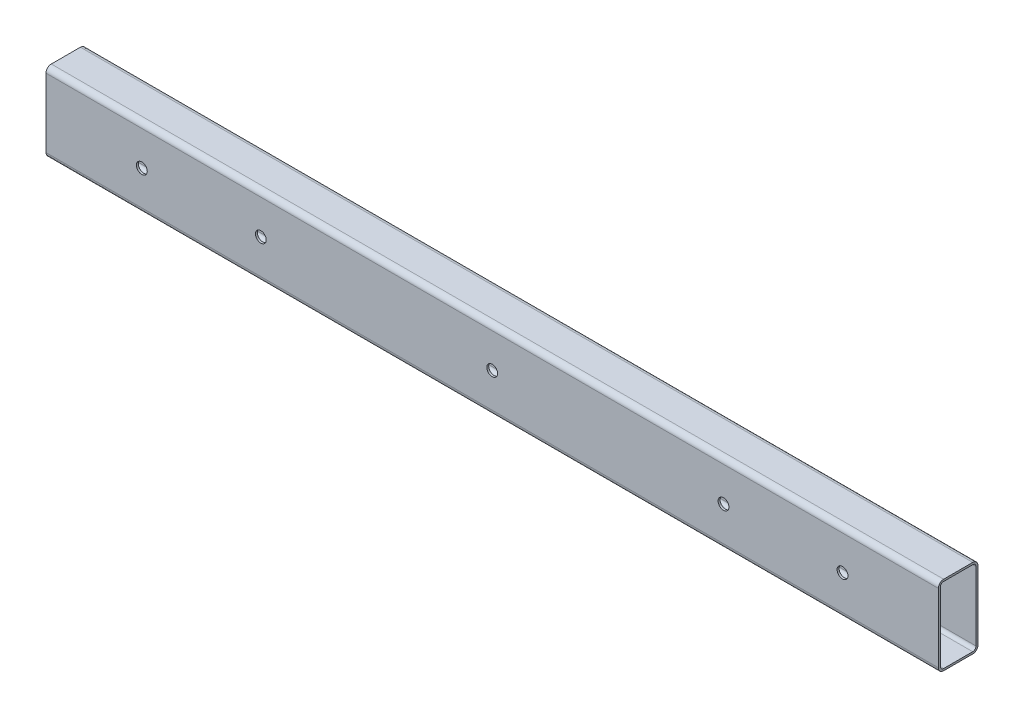
ISO-10303-21;
HEADER;
FILE_DESCRIPTION(('STEP AP214'),'2;1');
FILE_NAME('part.step','',(''),(''),'','','');
FILE_SCHEMA(('AUTOMOTIVE_DESIGN { 1 0 10303 214 1 1 1 1 }'));
ENDSEC;
DATA;
#1=APPLICATION_CONTEXT('core data for automotive mechanical design processes');
#2=APPLICATION_PROTOCOL_DEFINITION('international standard','automotive_design',2000,#1);
#3=PRODUCT_CONTEXT('',#1,'mechanical');
#4=PRODUCT('Part','Part','',(#3));
#5=PRODUCT_RELATED_PRODUCT_CATEGORY('part','',(#4));
#6=PRODUCT_DEFINITION_FORMATION('','',#4);
#7=PRODUCT_DEFINITION_CONTEXT('part definition',#1,'design');
#8=PRODUCT_DEFINITION('design','',#6,#7);
#9=PRODUCT_DEFINITION_SHAPE('','',#8);
#10=(LENGTH_UNIT() NAMED_UNIT(*) SI_UNIT(.MILLI.,.METRE.));
#11=(NAMED_UNIT(*) PLANE_ANGLE_UNIT() SI_UNIT($,.RADIAN.));
#12=(NAMED_UNIT(*) SI_UNIT($,.STERADIAN.) SOLID_ANGLE_UNIT());
#13=UNCERTAINTY_MEASURE_WITH_UNIT(LENGTH_MEASURE(1.E-05),#10,'distance_accuracy_value','');
#14=(GEOMETRIC_REPRESENTATION_CONTEXT(3) GLOBAL_UNCERTAINTY_ASSIGNED_CONTEXT((#13)) GLOBAL_UNIT_ASSIGNED_CONTEXT((#10,
#11,#12)) REPRESENTATION_CONTEXT('',''));
#15=CARTESIAN_POINT('',(0.,0.,0.));
#16=DIRECTION('',(0.,0.,1.));
#17=DIRECTION('',(1.,0.,0.));
#18=AXIS2_PLACEMENT_3D('',#15,#16,#17);
#19=CARTESIAN_POINT('',(-675.,-52.,22.));
#20=DIRECTION('',(1.,0.,0.));
#21=DIRECTION('',(0.,0.,-1.));
#22=AXIS2_PLACEMENT_3D('',#19,#20,#21);
#23=CYLINDRICAL_SURFACE('',#22,8.);
#24=DIRECTION('',(1.,0.,0.));
#25=VECTOR('',#24,1.);
#26=CARTESIAN_POINT('',(-675.,-60.,22.));
#27=LINE('',#26,#25);
#28=CARTESIAN_POINT('',(-675.,-60.,22.));
#29=VERTEX_POINT('',#28);
#30=CARTESIAN_POINT('',(675.,-60.,22.));
#31=VERTEX_POINT('',#30);
#32=EDGE_CURVE('E365',#29,#31,#27,.T.);
#33=ORIENTED_EDGE('',*,*,#32,.T.);
#34=CARTESIAN_POINT('',(675.,-52.,22.));
#35=DIRECTION('',(1.,0.,0.));
#36=DIRECTION('',(0.,0.,-1.));
#37=AXIS2_PLACEMENT_3D('',#34,#35,#36);
#38=CIRCLE('',#37,8.);
#39=CARTESIAN_POINT('',(675.,-52.,30.));
#40=VERTEX_POINT('',#39);
#41=EDGE_CURVE('E289',#40,#31,#38,.T.);
#42=ORIENTED_EDGE('',*,*,#41,.F.);
#43=DIRECTION('',(1.,0.,0.));
#44=VECTOR('',#43,1.);
#45=CARTESIAN_POINT('',(-675.,-52.,30.));
#46=LINE('',#45,#44);
#47=CARTESIAN_POINT('',(-675.,-52.,30.));
#48=VERTEX_POINT('',#47);
#49=EDGE_CURVE('E12',#48,#40,#46,.T.);
#50=ORIENTED_EDGE('',*,*,#49,.F.);
#51=CARTESIAN_POINT('',(-675.,-52.,22.));
#52=DIRECTION('',(1.,0.,0.));
#53=DIRECTION('',(0.,0.,-1.));
#54=AXIS2_PLACEMENT_3D('',#51,#52,#53);
#55=CIRCLE('',#54,8.);
#56=EDGE_CURVE('E332',#48,#29,#55,.T.);
#57=ORIENTED_EDGE('',*,*,#56,.T.);
#58=EDGE_LOOP('',(#33,#42,#50,#57));
#59=FACE_BOUND('',#58,.T.);
#60=ADVANCED_FACE('F131',(#59),#23,.T.);
#61=CARTESIAN_POINT('',(-675.,-52.,30.));
#62=DIRECTION('',(0.,0.,1.));
#63=DIRECTION('',(1.,0.,0.));
#64=AXIS2_PLACEMENT_3D('',#61,#62,#63);
#65=PLANE('',#64);
#66=CARTESIAN_POINT('',(-530.000000000008,7.7715611723761E-12,30.));
#67=DIRECTION('',(0.,0.,1.));
#68=DIRECTION('',(1.,0.,0.));
#69=AXIS2_PLACEMENT_3D('',#66,#67,#68);
#70=CIRCLE('',#69,8.19999999999973);
#71=CARTESIAN_POINT('',(-521.800000000008,7.7715611723761E-12,30.));
#72=VERTEX_POINT('',#71);
#73=EDGE_CURVE('E415',#72,#72,#70,.F.);
#74=ORIENTED_EDGE('',*,*,#73,.T.);
#75=EDGE_LOOP('',(#74));
#76=FACE_BOUND('',#75,.T.);
#77=CARTESIAN_POINT('',(-350.000000000007,4.66293670342566E-12,30.));
#78=DIRECTION('',(0.,0.,1.));
#79=DIRECTION('',(1.,0.,0.));
#80=AXIS2_PLACEMENT_3D('',#77,#78,#79);
#81=CIRCLE('',#80,8.2);
#82=CARTESIAN_POINT('',(-341.800000000007,4.66293670342566E-12,30.));
#83=VERTEX_POINT('',#82);
#84=EDGE_CURVE('E400',#83,#83,#81,.F.);
#85=ORIENTED_EDGE('',*,*,#84,.T.);
#86=EDGE_LOOP('',(#85));
#87=FACE_BOUND('',#86,.T.);
#88=CARTESIAN_POINT('',(529.999999999993,4.66293670342566E-12,30.));
#89=DIRECTION('',(0.,0.,1.));
#90=DIRECTION('',(1.,0.,0.));
#91=AXIS2_PLACEMENT_3D('',#88,#89,#90);
#92=CIRCLE('',#91,8.2);
#93=CARTESIAN_POINT('',(538.199999999993,4.66293670342566E-12,30.));
#94=VERTEX_POINT('',#93);
#95=EDGE_CURVE('E396',#94,#94,#92,.F.);
#96=ORIENTED_EDGE('',*,*,#95,.T.);
#97=EDGE_LOOP('',(#96));
#98=FACE_BOUND('',#97,.T.);
#99=CARTESIAN_POINT('',(349.999999999993,4.66293670342566E-12,30.));
#100=DIRECTION('',(0.,0.,1.));
#101=DIRECTION('',(1.,0.,0.));
#102=AXIS2_PLACEMENT_3D('',#99,#100,#101);
#103=CIRCLE('',#102,8.2);
#104=CARTESIAN_POINT('',(358.199999999993,4.66293670342566E-12,30.));
#105=VERTEX_POINT('',#104);
#106=EDGE_CURVE('E392',#105,#105,#103,.F.);
#107=ORIENTED_EDGE('',*,*,#106,.T.);
#108=EDGE_LOOP('',(#107));
#109=FACE_BOUND('',#108,.T.);
#110=CARTESIAN_POINT('',(0.,0.,30.));
#111=DIRECTION('',(0.,0.,1.));
#112=DIRECTION('',(1.,0.,0.));
#113=AXIS2_PLACEMENT_3D('',#110,#111,#112);
#114=CIRCLE('',#113,8.2);
#115=CARTESIAN_POINT('',(8.2,0.,30.));
#116=VERTEX_POINT('',#115);
#117=EDGE_CURVE('E383',#116,#116,#114,.T.);
#118=ORIENTED_EDGE('',*,*,#117,.F.);
#119=EDGE_LOOP('',(#118));
#120=FACE_BOUND('',#119,.T.);
#121=ORIENTED_EDGE('',*,*,#49,.T.);
#122=DIRECTION('',(0.,-1.,0.));
#123=VECTOR('',#122,1.);
#124=CARTESIAN_POINT('',(675.,-52.,30.));
#125=LINE('',#124,#123);
#126=CARTESIAN_POINT('',(675.,52.,30.));
#127=VERTEX_POINT('',#126);
#128=EDGE_CURVE('E310',#127,#40,#125,.T.);
#129=ORIENTED_EDGE('',*,*,#128,.F.);
#130=DIRECTION('',(1.,0.,0.));
#131=VECTOR('',#130,1.);
#132=CARTESIAN_POINT('',(-675.,52.,30.));
#133=LINE('',#132,#131);
#134=CARTESIAN_POINT('',(-675.,52.,30.));
#135=VERTEX_POINT('',#134);
#136=EDGE_CURVE('E139',#135,#127,#133,.T.);
#137=ORIENTED_EDGE('',*,*,#136,.F.);
#138=DIRECTION('',(0.,-1.,0.));
#139=VECTOR('',#138,1.);
#140=CARTESIAN_POINT('',(-675.,-52.,30.));
#141=LINE('',#140,#139);
#142=EDGE_CURVE('E363',#135,#48,#141,.T.);
#143=ORIENTED_EDGE('',*,*,#142,.T.);
#144=EDGE_LOOP('',(#121,#129,#137,#143));
#145=FACE_BOUND('',#144,.T.);
#146=ADVANCED_FACE('F454',(#76,#87,#98,#109,#120,#145),#65,.T.);
#147=CARTESIAN_POINT('',(-675.,52.,22.));
#148=DIRECTION('',(1.,0.,0.));
#149=DIRECTION('',(0.,0.,-1.));
#150=AXIS2_PLACEMENT_3D('',#147,#148,#149);
#151=CYLINDRICAL_SURFACE('',#150,8.);
#152=ORIENTED_EDGE('',*,*,#136,.T.);
#153=CARTESIAN_POINT('',(675.,52.,22.));
#154=DIRECTION('',(1.,0.,0.));
#155=DIRECTION('',(0.,0.,-1.));
#156=AXIS2_PLACEMENT_3D('',#153,#154,#155);
#157=CIRCLE('',#156,8.);
#158=CARTESIAN_POINT('',(675.,60.,22.));
#159=VERTEX_POINT('',#158);
#160=EDGE_CURVE('E307',#159,#127,#157,.T.);
#161=ORIENTED_EDGE('',*,*,#160,.F.);
#162=DIRECTION('',(1.,0.,0.));
#163=VECTOR('',#162,1.);
#164=CARTESIAN_POINT('',(-675.,60.,22.));
#165=LINE('',#164,#163);
#166=CARTESIAN_POINT('',(-675.,60.,22.));
#167=VERTEX_POINT('',#166);
#168=EDGE_CURVE('E368',#167,#159,#165,.T.);
#169=ORIENTED_EDGE('',*,*,#168,.F.);
#170=CARTESIAN_POINT('',(-675.,52.,22.));
#171=DIRECTION('',(1.,0.,0.));
#172=DIRECTION('',(0.,0.,-1.));
#173=AXIS2_PLACEMENT_3D('',#170,#171,#172);
#174=CIRCLE('',#173,8.);
#175=EDGE_CURVE('E360',#167,#135,#174,.T.);
#176=ORIENTED_EDGE('',*,*,#175,.T.);
#177=EDGE_LOOP('',(#152,#161,#169,#176));
#178=FACE_BOUND('',#177,.T.);
#179=ADVANCED_FACE('F450',(#178),#151,.T.);
#180=CARTESIAN_POINT('',(-675.,60.,22.));
#181=DIRECTION('',(0.,1.,0.));
#182=DIRECTION('',(0.,0.,1.));
#183=AXIS2_PLACEMENT_3D('',#180,#181,#182);
#184=PLANE('',#183);
#185=ORIENTED_EDGE('',*,*,#168,.T.);
#186=DIRECTION('',(0.,0.,1.));
#187=VECTOR('',#186,1.);
#188=CARTESIAN_POINT('',(675.,60.,22.));
#189=LINE('',#188,#187);
#190=CARTESIAN_POINT('',(675.,60.,-22.));
#191=VERTEX_POINT('',#190);
#192=EDGE_CURVE('E304',#191,#159,#189,.T.);
#193=ORIENTED_EDGE('',*,*,#192,.F.);
#194=DIRECTION('',(1.,0.,0.));
#195=VECTOR('',#194,1.);
#196=CARTESIAN_POINT('',(-675.,60.,-22.));
#197=LINE('',#196,#195);
#198=CARTESIAN_POINT('',(-675.,60.,-22.));
#199=VERTEX_POINT('',#198);
#200=EDGE_CURVE('E370',#199,#191,#197,.T.);
#201=ORIENTED_EDGE('',*,*,#200,.F.);
#202=DIRECTION('',(0.,0.,1.));
#203=VECTOR('',#202,1.);
#204=CARTESIAN_POINT('',(-675.,60.,22.));
#205=LINE('',#204,#203);
#206=EDGE_CURVE('E357',#199,#167,#205,.T.);
#207=ORIENTED_EDGE('',*,*,#206,.T.);
#208=EDGE_LOOP('',(#185,#193,#201,#207));
#209=FACE_BOUND('',#208,.T.);
#210=ADVANCED_FACE('F444',(#209),#184,.T.);
#211=CARTESIAN_POINT('',(-675.,52.,-22.));
#212=DIRECTION('',(1.,0.,0.));
#213=DIRECTION('',(0.,0.,-1.));
#214=AXIS2_PLACEMENT_3D('',#211,#212,#213);
#215=CYLINDRICAL_SURFACE('',#214,8.);
#216=ORIENTED_EDGE('',*,*,#200,.T.);
#217=CARTESIAN_POINT('',(675.,52.,-22.));
#218=DIRECTION('',(1.,0.,0.));
#219=DIRECTION('',(0.,0.,-1.));
#220=AXIS2_PLACEMENT_3D('',#217,#218,#219);
#221=CIRCLE('',#220,8.);
#222=CARTESIAN_POINT('',(675.,52.,-30.));
#223=VERTEX_POINT('',#222);
#224=EDGE_CURVE('E301',#223,#191,#221,.T.);
#225=ORIENTED_EDGE('',*,*,#224,.F.);
#226=DIRECTION('',(1.,0.,0.));
#227=VECTOR('',#226,1.);
#228=CARTESIAN_POINT('',(-675.,52.,-30.));
#229=LINE('',#228,#227);
#230=CARTESIAN_POINT('',(-675.,52.,-30.));
#231=VERTEX_POINT('',#230);
#232=EDGE_CURVE('E372',#231,#223,#229,.T.);
#233=ORIENTED_EDGE('',*,*,#232,.F.);
#234=CARTESIAN_POINT('',(-675.,52.,-22.));
#235=DIRECTION('',(1.,0.,0.));
#236=DIRECTION('',(0.,0.,-1.));
#237=AXIS2_PLACEMENT_3D('',#234,#235,#236);
#238=CIRCLE('',#237,8.);
#239=EDGE_CURVE('E354',#231,#199,#238,.T.);
#240=ORIENTED_EDGE('',*,*,#239,.T.);
#241=EDGE_LOOP('',(#216,#225,#233,#240));
#242=FACE_BOUND('',#241,.T.);
#243=ADVANCED_FACE('F431',(#242),#215,.T.);
#244=CARTESIAN_POINT('',(-675.,-52.,-30.));
#245=DIRECTION('',(0.,0.,-1.));
#246=DIRECTION('',(-1.,0.,0.));
#247=AXIS2_PLACEMENT_3D('',#244,#245,#246);
#248=PLANE('',#247);
#249=CARTESIAN_POINT('',(-530.000000000008,7.7715611723761E-12,-30.0000000000103));
#250=DIRECTION('',(0.,0.,1.));
#251=DIRECTION('',(1.,0.,0.));
#252=AXIS2_PLACEMENT_3D('',#249,#250,#251);
#253=CIRCLE('',#252,8.19999999999973);
#254=CARTESIAN_POINT('',(-521.800000000008,7.7715611723761E-12,-30.0000000000103));
#255=VERTEX_POINT('',#254);
#256=EDGE_CURVE('E632',#255,#255,#253,.T.);
#257=ORIENTED_EDGE('',*,*,#256,.T.);
#258=EDGE_LOOP('',(#257));
#259=FACE_BOUND('',#258,.T.);
#260=CARTESIAN_POINT('',(-350.000000000007,4.66293670342566E-12,-30.0000000000103));
#261=DIRECTION('',(0.,0.,1.));
#262=DIRECTION('',(1.,0.,0.));
#263=AXIS2_PLACEMENT_3D('',#260,#261,#262);
#264=CIRCLE('',#263,8.2);
#265=CARTESIAN_POINT('',(-341.800000000007,4.66293670342566E-12,-30.0000000000103));
#266=VERTEX_POINT('',#265);
#267=EDGE_CURVE('E636',#266,#266,#264,.T.);
#268=ORIENTED_EDGE('',*,*,#267,.T.);
#269=EDGE_LOOP('',(#268));
#270=FACE_BOUND('',#269,.T.);
#271=CARTESIAN_POINT('',(529.999999999993,4.66293670342566E-12,-30.0000000000103));
#272=DIRECTION('',(0.,0.,1.));
#273=DIRECTION('',(1.,0.,0.));
#274=AXIS2_PLACEMENT_3D('',#271,#272,#273);
#275=CIRCLE('',#274,8.2);
#276=CARTESIAN_POINT('',(538.199999999993,4.66293670342566E-12,-30.0000000000103));
#277=VERTEX_POINT('',#276);
#278=EDGE_CURVE('E565',#277,#277,#275,.T.);
#279=ORIENTED_EDGE('',*,*,#278,.T.);
#280=EDGE_LOOP('',(#279));
#281=FACE_BOUND('',#280,.T.);
#282=CARTESIAN_POINT('',(349.999999999993,4.66293670342566E-12,-30.0000000000103));
#283=DIRECTION('',(0.,0.,1.));
#284=DIRECTION('',(1.,0.,0.));
#285=AXIS2_PLACEMENT_3D('',#282,#283,#284);
#286=CIRCLE('',#285,8.2);
#287=CARTESIAN_POINT('',(358.199999999993,4.66293670342566E-12,-30.0000000000103));
#288=VERTEX_POINT('',#287);
#289=EDGE_CURVE('E388',#288,#288,#286,.T.);
#290=ORIENTED_EDGE('',*,*,#289,.T.);
#291=EDGE_LOOP('',(#290));
#292=FACE_BOUND('',#291,.T.);
#293=CARTESIAN_POINT('',(0.,0.,-30.));
#294=DIRECTION('',(0.,0.,-1.));
#295=DIRECTION('',(-1.,0.,0.));
#296=AXIS2_PLACEMENT_3D('',#293,#294,#295);
#297=CIRCLE('',#296,8.2);
#298=CARTESIAN_POINT('',(-8.2,0.,-30.));
#299=VERTEX_POINT('',#298);
#300=EDGE_CURVE('E265',#299,#299,#297,.T.);
#301=ORIENTED_EDGE('',*,*,#300,.F.);
#302=EDGE_LOOP('',(#301));
#303=FACE_BOUND('',#302,.T.);
#304=ORIENTED_EDGE('',*,*,#232,.T.);
#305=DIRECTION('',(0.,1.,0.));
#306=VECTOR('',#305,1.);
#307=CARTESIAN_POINT('',(675.,-52.,-30.));
#308=LINE('',#307,#306);
#309=CARTESIAN_POINT('',(675.,-52.,-30.));
#310=VERTEX_POINT('',#309);
#311=EDGE_CURVE('E298',#310,#223,#308,.T.);
#312=ORIENTED_EDGE('',*,*,#311,.F.);
#313=DIRECTION('',(1.,0.,0.));
#314=VECTOR('',#313,1.);
#315=CARTESIAN_POINT('',(-675.,-52.,-30.));
#316=LINE('',#315,#314);
#317=CARTESIAN_POINT('',(-675.,-52.,-30.));
#318=VERTEX_POINT('',#317);
#319=EDGE_CURVE('E374',#318,#310,#316,.T.);
#320=ORIENTED_EDGE('',*,*,#319,.F.);
#321=DIRECTION('',(0.,1.,0.));
#322=VECTOR('',#321,1.);
#323=CARTESIAN_POINT('',(-675.,-52.,-30.));
#324=LINE('',#323,#322);
#325=EDGE_CURVE('E351',#318,#231,#324,.T.);
#326=ORIENTED_EDGE('',*,*,#325,.T.);
#327=EDGE_LOOP('',(#304,#312,#320,#326));
#328=FACE_BOUND('',#327,.T.);
#329=ADVANCED_FACE('F427',(#259,#270,#281,#292,#303,#328),#248,.T.);
#330=CARTESIAN_POINT('',(-675.,-52.,-22.));
#331=DIRECTION('',(1.,0.,0.));
#332=DIRECTION('',(0.,0.,-1.));
#333=AXIS2_PLACEMENT_3D('',#330,#331,#332);
#334=CYLINDRICAL_SURFACE('',#333,8.);
#335=ORIENTED_EDGE('',*,*,#319,.T.);
#336=CARTESIAN_POINT('',(675.,-52.,-22.));
#337=DIRECTION('',(1.,0.,0.));
#338=DIRECTION('',(0.,0.,-1.));
#339=AXIS2_PLACEMENT_3D('',#336,#337,#338);
#340=CIRCLE('',#339,8.);
#341=CARTESIAN_POINT('',(675.,-60.,-22.));
#342=VERTEX_POINT('',#341);
#343=EDGE_CURVE('E295',#342,#310,#340,.T.);
#344=ORIENTED_EDGE('',*,*,#343,.F.);
#345=DIRECTION('',(1.,0.,0.));
#346=VECTOR('',#345,1.);
#347=CARTESIAN_POINT('',(-675.,-60.,-22.));
#348=LINE('',#347,#346);
#349=CARTESIAN_POINT('',(-675.,-60.,-22.));
#350=VERTEX_POINT('',#349);
#351=EDGE_CURVE('E376',#350,#342,#348,.T.);
#352=ORIENTED_EDGE('',*,*,#351,.F.);
#353=CARTESIAN_POINT('',(-675.,-52.,-22.));
#354=DIRECTION('',(1.,0.,0.));
#355=DIRECTION('',(0.,0.,-1.));
#356=AXIS2_PLACEMENT_3D('',#353,#354,#355);
#357=CIRCLE('',#356,8.);
#358=EDGE_CURVE('E348',#350,#318,#357,.T.);
#359=ORIENTED_EDGE('',*,*,#358,.T.);
#360=EDGE_LOOP('',(#335,#344,#352,#359));
#361=FACE_BOUND('',#360,.T.);
#362=ADVANCED_FACE('F430',(#361),#334,.T.);
#363=CARTESIAN_POINT('',(-675.,-60.,22.));
#364=DIRECTION('',(0.,-1.,0.));
#365=DIRECTION('',(0.,0.,-1.));
#366=AXIS2_PLACEMENT_3D('',#363,#364,#365);
#367=PLANE('',#366);
#368=ORIENTED_EDGE('',*,*,#351,.T.);
#369=DIRECTION('',(0.,0.,-1.));
#370=VECTOR('',#369,1.);
#371=CARTESIAN_POINT('',(675.,-60.,22.));
#372=LINE('',#371,#370);
#373=EDGE_CURVE('E292',#31,#342,#372,.T.);
#374=ORIENTED_EDGE('',*,*,#373,.F.);
#375=ORIENTED_EDGE('',*,*,#32,.F.);
#376=DIRECTION('',(0.,0.,-1.));
#377=VECTOR('',#376,1.);
#378=CARTESIAN_POINT('',(-675.,-60.,22.));
#379=LINE('',#378,#377);
#380=EDGE_CURVE('E345',#29,#350,#379,.T.);
#381=ORIENTED_EDGE('',*,*,#380,.T.);
#382=EDGE_LOOP('',(#368,#374,#375,#381));
#383=FACE_BOUND('',#382,.T.);
#384=ADVANCED_FACE('F473',(#383),#367,.T.);
#385=CARTESIAN_POINT('',(-675.,-52.,22.));
#386=DIRECTION('',(1.,0.,0.));
#387=DIRECTION('',(0.,0.,-1.));
#388=AXIS2_PLACEMENT_3D('',#385,#386,#387);
#389=PLANE('',#388);
#390=DIRECTION('',(0.,-1.,0.));
#391=VECTOR('',#390,1.);
#392=CARTESIAN_POINT('',(-675.,-52.,27.));
#393=LINE('',#392,#391);
#394=CARTESIAN_POINT('',(-675.,52.,27.));
#395=VERTEX_POINT('',#394);
#396=CARTESIAN_POINT('',(-675.,-52.,27.));
#397=VERTEX_POINT('',#396);
#398=EDGE_CURVE('E256',#395,#397,#393,.T.);
#399=ORIENTED_EDGE('',*,*,#398,.T.);
#400=CARTESIAN_POINT('',(-675.,-52.,22.));
#401=DIRECTION('',(1.,0.,0.));
#402=DIRECTION('',(0.,0.,-1.));
#403=AXIS2_PLACEMENT_3D('',#400,#401,#402);
#404=CIRCLE('',#403,5.);
#405=CARTESIAN_POINT('',(-675.,-57.,22.));
#406=VERTEX_POINT('',#405);
#407=EDGE_CURVE('E313',#397,#406,#404,.T.);
#408=ORIENTED_EDGE('',*,*,#407,.T.);
#409=DIRECTION('',(0.,0.,-1.));
#410=VECTOR('',#409,1.);
#411=CARTESIAN_POINT('',(-675.,-57.,22.));
#412=LINE('',#411,#410);
#413=CARTESIAN_POINT('',(-675.,-57.,-22.));
#414=VERTEX_POINT('',#413);
#415=EDGE_CURVE('E251',#406,#414,#412,.T.);
#416=ORIENTED_EDGE('',*,*,#415,.T.);
#417=CARTESIAN_POINT('',(-675.,-52.,-22.));
#418=DIRECTION('',(1.,0.,0.));
#419=DIRECTION('',(0.,0.,-1.));
#420=AXIS2_PLACEMENT_3D('',#417,#418,#419);
#421=CIRCLE('',#420,5.);
#422=CARTESIAN_POINT('',(-675.,-52.,-27.));
#423=VERTEX_POINT('',#422);
#424=EDGE_CURVE('E147',#414,#423,#421,.T.);
#425=ORIENTED_EDGE('',*,*,#424,.T.);
#426=DIRECTION('',(0.,1.,0.));
#427=VECTOR('',#426,1.);
#428=CARTESIAN_POINT('',(-675.,-52.,-27.));
#429=LINE('',#428,#427);
#430=CARTESIAN_POINT('',(-675.,52.,-27.));
#431=VERTEX_POINT('',#430);
#432=EDGE_CURVE('E317',#423,#431,#429,.T.);
#433=ORIENTED_EDGE('',*,*,#432,.T.);
#434=CARTESIAN_POINT('',(-675.,52.,-22.));
#435=DIRECTION('',(1.,0.,0.));
#436=DIRECTION('',(0.,0.,-1.));
#437=AXIS2_PLACEMENT_3D('',#434,#435,#436);
#438=CIRCLE('',#437,5.);
#439=CARTESIAN_POINT('',(-675.,57.,-22.));
#440=VERTEX_POINT('',#439);
#441=EDGE_CURVE('E320',#431,#440,#438,.T.);
#442=ORIENTED_EDGE('',*,*,#441,.T.);
#443=DIRECTION('',(0.,0.,1.));
#444=VECTOR('',#443,1.);
#445=CARTESIAN_POINT('',(-675.,57.,22.));
#446=LINE('',#445,#444);
#447=CARTESIAN_POINT('',(-675.,57.,22.));
#448=VERTEX_POINT('',#447);
#449=EDGE_CURVE('E323',#440,#448,#446,.T.);
#450=ORIENTED_EDGE('',*,*,#449,.T.);
#451=CARTESIAN_POINT('',(-675.,52.,22.));
#452=DIRECTION('',(1.,0.,0.));
#453=DIRECTION('',(0.,0.,-1.));
#454=AXIS2_PLACEMENT_3D('',#451,#452,#453);
#455=CIRCLE('',#454,5.);
#456=EDGE_CURVE('E326',#448,#395,#455,.T.);
#457=ORIENTED_EDGE('',*,*,#456,.T.);
#458=EDGE_LOOP('',(#399,#408,#416,#425,#433,#442,#450,#457));
#459=FACE_BOUND('',#458,.T.);
#460=ORIENTED_EDGE('',*,*,#56,.F.);
#461=ORIENTED_EDGE('',*,*,#142,.F.);
#462=ORIENTED_EDGE('',*,*,#175,.F.);
#463=ORIENTED_EDGE('',*,*,#206,.F.);
#464=ORIENTED_EDGE('',*,*,#239,.F.);
#465=ORIENTED_EDGE('',*,*,#325,.F.);
#466=ORIENTED_EDGE('',*,*,#358,.F.);
#467=ORIENTED_EDGE('',*,*,#380,.F.);
#468=EDGE_LOOP('',(#460,#461,#462,#463,#464,#465,#466,#467));
#469=FACE_BOUND('',#468,.T.);
#470=ADVANCED_FACE('F447',(#459,#469),#389,.F.);
#471=CARTESIAN_POINT('',(-675.,-52.,22.));
#472=DIRECTION('',(1.,0.,0.));
#473=DIRECTION('',(0.,0.,-1.));
#474=AXIS2_PLACEMENT_3D('',#471,#472,#473);
#475=CYLINDRICAL_SURFACE('',#474,5.);
#476=DIRECTION('',(1.,0.,0.));
#477=VECTOR('',#476,1.);
#478=CARTESIAN_POINT('',(-675.,-52.,27.));
#479=LINE('',#478,#477);
#480=CARTESIAN_POINT('',(675.,-52.,27.));
#481=VERTEX_POINT('',#480);
#482=EDGE_CURVE('E261',#397,#481,#479,.T.);
#483=ORIENTED_EDGE('',*,*,#482,.T.);
#484=CARTESIAN_POINT('',(675.,-52.,22.));
#485=DIRECTION('',(1.,0.,0.));
#486=DIRECTION('',(0.,0.,-1.));
#487=AXIS2_PLACEMENT_3D('',#484,#485,#486);
#488=CIRCLE('',#487,5.);
#489=CARTESIAN_POINT('',(675.,-57.,22.));
#490=VERTEX_POINT('',#489);
#491=EDGE_CURVE('E259',#481,#490,#488,.T.);
#492=ORIENTED_EDGE('',*,*,#491,.T.);
#493=DIRECTION('',(1.,0.,0.));
#494=VECTOR('',#493,1.);
#495=CARTESIAN_POINT('',(-675.,-57.,22.));
#496=LINE('',#495,#494);
#497=EDGE_CURVE('E244',#406,#490,#496,.T.);
#498=ORIENTED_EDGE('',*,*,#497,.F.);
#499=ORIENTED_EDGE('',*,*,#407,.F.);
#500=EDGE_LOOP('',(#483,#492,#498,#499));
#501=FACE_BOUND('',#500,.T.);
#502=ADVANCED_FACE('F260',(#501),#475,.F.);
#503=CARTESIAN_POINT('',(-675.,-52.,27.));
#504=DIRECTION('',(0.,0.,1.));
#505=DIRECTION('',(1.,0.,0.));
#506=AXIS2_PLACEMENT_3D('',#503,#504,#505);
#507=PLANE('',#506);
#508=CARTESIAN_POINT('',(-530.000000000008,7.7715611723761E-12,27.));
#509=DIRECTION('',(0.,0.,1.));
#510=DIRECTION('',(1.,0.,0.));
#511=AXIS2_PLACEMENT_3D('',#508,#509,#510);
#512=CIRCLE('',#511,8.19999999999973);
#513=CARTESIAN_POINT('',(-521.800000000008,7.7715611723761E-12,27.));
#514=VERTEX_POINT('',#513);
#515=EDGE_CURVE('E412',#514,#514,#512,.F.);
#516=ORIENTED_EDGE('',*,*,#515,.F.);
#517=EDGE_LOOP('',(#516));
#518=FACE_BOUND('',#517,.T.);
#519=CARTESIAN_POINT('',(-350.000000000007,4.66293670342566E-12,27.));
#520=DIRECTION('',(0.,0.,1.));
#521=DIRECTION('',(1.,0.,0.));
#522=AXIS2_PLACEMENT_3D('',#519,#520,#521);
#523=CIRCLE('',#522,8.2);
#524=CARTESIAN_POINT('',(-341.800000000007,4.66293670342566E-12,27.));
#525=VERTEX_POINT('',#524);
#526=EDGE_CURVE('E395',#525,#525,#523,.F.);
#527=ORIENTED_EDGE('',*,*,#526,.F.);
#528=EDGE_LOOP('',(#527));
#529=FACE_BOUND('',#528,.T.);
#530=CARTESIAN_POINT('',(529.999999999993,4.66293670342566E-12,27.));
#531=DIRECTION('',(0.,0.,1.));
#532=DIRECTION('',(1.,0.,0.));
#533=AXIS2_PLACEMENT_3D('',#530,#531,#532);
#534=CIRCLE('',#533,8.2);
#535=CARTESIAN_POINT('',(538.199999999993,4.66293670342566E-12,27.));
#536=VERTEX_POINT('',#535);
#537=EDGE_CURVE('E391',#536,#536,#534,.F.);
#538=ORIENTED_EDGE('',*,*,#537,.F.);
#539=EDGE_LOOP('',(#538));
#540=FACE_BOUND('',#539,.T.);
#541=CARTESIAN_POINT('',(349.999999999993,4.66293670342566E-12,27.));
#542=DIRECTION('',(0.,0.,1.));
#543=DIRECTION('',(1.,0.,0.));
#544=AXIS2_PLACEMENT_3D('',#541,#542,#543);
#545=CIRCLE('',#544,8.2);
#546=CARTESIAN_POINT('',(358.199999999993,4.66293670342566E-12,27.));
#547=VERTEX_POINT('',#546);
#548=EDGE_CURVE('E387',#547,#547,#545,.F.);
#549=ORIENTED_EDGE('',*,*,#548,.F.);
#550=EDGE_LOOP('',(#549));
#551=FACE_BOUND('',#550,.T.);
#552=CARTESIAN_POINT('',(0.,0.,27.));
#553=DIRECTION('',(0.,0.,1.));
#554=DIRECTION('',(1.,0.,0.));
#555=AXIS2_PLACEMENT_3D('',#552,#553,#554);
#556=CIRCLE('',#555,8.2);
#557=CARTESIAN_POINT('',(8.2,0.,27.));
#558=VERTEX_POINT('',#557);
#559=EDGE_CURVE('E382',#558,#558,#556,.T.);
#560=ORIENTED_EDGE('',*,*,#559,.T.);
#561=EDGE_LOOP('',(#560));
#562=FACE_BOUND('',#561,.T.);
#563=DIRECTION('',(1.,0.,0.));
#564=VECTOR('',#563,1.);
#565=CARTESIAN_POINT('',(-675.,52.,27.));
#566=LINE('',#565,#564);
#567=CARTESIAN_POINT('',(675.,52.,27.));
#568=VERTEX_POINT('',#567);
#569=EDGE_CURVE('E333',#395,#568,#566,.T.);
#570=ORIENTED_EDGE('',*,*,#569,.T.);
#571=DIRECTION('',(0.,-1.,0.));
#572=VECTOR('',#571,1.);
#573=CARTESIAN_POINT('',(675.,-52.,27.));
#574=LINE('',#573,#572);
#575=EDGE_CURVE('E287',#568,#481,#574,.T.);
#576=ORIENTED_EDGE('',*,*,#575,.T.);
#577=ORIENTED_EDGE('',*,*,#482,.F.);
#578=ORIENTED_EDGE('',*,*,#398,.F.);
#579=EDGE_LOOP('',(#570,#576,#577,#578));
#580=FACE_BOUND('',#579,.T.);
#581=ADVANCED_FACE('F487',(#518,#529,#540,#551,#562,#580),#507,.F.);
#582=CARTESIAN_POINT('',(-675.,52.,22.));
#583=DIRECTION('',(1.,0.,0.));
#584=DIRECTION('',(0.,0.,-1.));
#585=AXIS2_PLACEMENT_3D('',#582,#583,#584);
#586=CYLINDRICAL_SURFACE('',#585,5.);
#587=DIRECTION('',(1.,0.,0.));
#588=VECTOR('',#587,1.);
#589=CARTESIAN_POINT('',(-675.,57.,22.));
#590=LINE('',#589,#588);
#591=CARTESIAN_POINT('',(675.,57.,22.));
#592=VERTEX_POINT('',#591);
#593=EDGE_CURVE('E335',#448,#592,#590,.T.);
#594=ORIENTED_EDGE('',*,*,#593,.T.);
#595=CARTESIAN_POINT('',(675.,52.,22.));
#596=DIRECTION('',(1.,0.,0.));
#597=DIRECTION('',(0.,0.,-1.));
#598=AXIS2_PLACEMENT_3D('',#595,#596,#597);
#599=CIRCLE('',#598,5.);
#600=EDGE_CURVE('E284',#592,#568,#599,.T.);
#601=ORIENTED_EDGE('',*,*,#600,.T.);
#602=ORIENTED_EDGE('',*,*,#569,.F.);
#603=ORIENTED_EDGE('',*,*,#456,.F.);
#604=EDGE_LOOP('',(#594,#601,#602,#603));
#605=FACE_BOUND('',#604,.T.);
#606=ADVANCED_FACE('F495',(#605),#586,.F.);
#607=CARTESIAN_POINT('',(-675.,57.,22.));
#608=DIRECTION('',(0.,1.,0.));
#609=DIRECTION('',(0.,0.,1.));
#610=AXIS2_PLACEMENT_3D('',#607,#608,#609);
#611=PLANE('',#610);
#612=DIRECTION('',(1.,0.,0.));
#613=VECTOR('',#612,1.);
#614=CARTESIAN_POINT('',(-675.,57.,-22.));
#615=LINE('',#614,#613);
#616=CARTESIAN_POINT('',(675.,57.,-22.));
#617=VERTEX_POINT('',#616);
#618=EDGE_CURVE('E337',#440,#617,#615,.T.);
#619=ORIENTED_EDGE('',*,*,#618,.T.);
#620=DIRECTION('',(0.,0.,1.));
#621=VECTOR('',#620,1.);
#622=CARTESIAN_POINT('',(675.,57.,22.));
#623=LINE('',#622,#621);
#624=EDGE_CURVE('E281',#617,#592,#623,.T.);
#625=ORIENTED_EDGE('',*,*,#624,.T.);
#626=ORIENTED_EDGE('',*,*,#593,.F.);
#627=ORIENTED_EDGE('',*,*,#449,.F.);
#628=EDGE_LOOP('',(#619,#625,#626,#627));
#629=FACE_BOUND('',#628,.T.);
#630=ADVANCED_FACE('F498',(#629),#611,.F.);
#631=CARTESIAN_POINT('',(-675.,52.,-22.));
#632=DIRECTION('',(1.,0.,0.));
#633=DIRECTION('',(0.,0.,-1.));
#634=AXIS2_PLACEMENT_3D('',#631,#632,#633);
#635=CYLINDRICAL_SURFACE('',#634,5.);
#636=DIRECTION('',(1.,0.,0.));
#637=VECTOR('',#636,1.);
#638=CARTESIAN_POINT('',(-675.,52.,-27.));
#639=LINE('',#638,#637);
#640=CARTESIAN_POINT('',(675.,52.,-27.));
#641=VERTEX_POINT('',#640);
#642=EDGE_CURVE('E339',#431,#641,#639,.T.);
#643=ORIENTED_EDGE('',*,*,#642,.T.);
#644=CARTESIAN_POINT('',(675.,52.,-22.));
#645=DIRECTION('',(1.,0.,0.));
#646=DIRECTION('',(0.,0.,-1.));
#647=AXIS2_PLACEMENT_3D('',#644,#645,#646);
#648=CIRCLE('',#647,5.);
#649=EDGE_CURVE('E278',#641,#617,#648,.T.);
#650=ORIENTED_EDGE('',*,*,#649,.T.);
#651=ORIENTED_EDGE('',*,*,#618,.F.);
#652=ORIENTED_EDGE('',*,*,#441,.F.);
#653=EDGE_LOOP('',(#643,#650,#651,#652));
#654=FACE_BOUND('',#653,.T.);
#655=ADVANCED_FACE('F501',(#654),#635,.F.);
#656=CARTESIAN_POINT('',(-675.,-52.,-27.));
#657=DIRECTION('',(0.,0.,-1.));
#658=DIRECTION('',(-1.,0.,0.));
#659=AXIS2_PLACEMENT_3D('',#656,#657,#658);
#660=PLANE('',#659);
#661=CARTESIAN_POINT('',(-530.000000000008,7.7715611723761E-12,-27.));
#662=DIRECTION('',(0.,0.,-1.));
#663=DIRECTION('',(-1.,0.,0.));
#664=AXIS2_PLACEMENT_3D('',#661,#662,#663);
#665=CIRCLE('',#664,8.19999999999973);
#666=CARTESIAN_POINT('',(-538.200000000007,7.7715611723761E-12,-27.));
#667=VERTEX_POINT('',#666);
#668=EDGE_CURVE('E134',#667,#667,#665,.F.);
#669=ORIENTED_EDGE('',*,*,#668,.F.);
#670=EDGE_LOOP('',(#669));
#671=FACE_BOUND('',#670,.T.);
#672=CARTESIAN_POINT('',(-350.000000000007,4.66293670342566E-12,-27.));
#673=DIRECTION('',(0.,0.,-1.));
#674=DIRECTION('',(-1.,0.,0.));
#675=AXIS2_PLACEMENT_3D('',#672,#673,#674);
#676=CIRCLE('',#675,8.2);
#677=CARTESIAN_POINT('',(-358.200000000007,4.66293670342566E-12,-27.));
#678=VERTEX_POINT('',#677);
#679=EDGE_CURVE('E393',#678,#678,#676,.F.);
#680=ORIENTED_EDGE('',*,*,#679,.F.);
#681=EDGE_LOOP('',(#680));
#682=FACE_BOUND('',#681,.T.);
#683=CARTESIAN_POINT('',(529.999999999993,4.66293670342566E-12,-27.));
#684=DIRECTION('',(0.,0.,-1.));
#685=DIRECTION('',(-1.,0.,0.));
#686=AXIS2_PLACEMENT_3D('',#683,#684,#685);
#687=CIRCLE('',#686,8.2);
#688=CARTESIAN_POINT('',(521.799999999993,4.66293670342566E-12,-27.));
#689=VERTEX_POINT('',#688);
#690=EDGE_CURVE('E389',#689,#689,#687,.F.);
#691=ORIENTED_EDGE('',*,*,#690,.F.);
#692=EDGE_LOOP('',(#691));
#693=FACE_BOUND('',#692,.T.);
#694=CARTESIAN_POINT('',(349.999999999993,4.66293670342566E-12,-27.));
#695=DIRECTION('',(0.,0.,-1.));
#696=DIRECTION('',(-1.,0.,0.));
#697=AXIS2_PLACEMENT_3D('',#694,#695,#696);
#698=CIRCLE('',#697,8.2);
#699=CARTESIAN_POINT('',(341.799999999993,4.66293670342566E-12,-27.));
#700=VERTEX_POINT('',#699);
#701=EDGE_CURVE('E384',#700,#700,#698,.F.);
#702=ORIENTED_EDGE('',*,*,#701,.F.);
#703=EDGE_LOOP('',(#702));
#704=FACE_BOUND('',#703,.T.);
#705=CARTESIAN_POINT('',(0.,0.,-27.));
#706=DIRECTION('',(0.,0.,-1.));
#707=DIRECTION('',(-1.,0.,0.));
#708=AXIS2_PLACEMENT_3D('',#705,#706,#707);
#709=CIRCLE('',#708,8.2);
#710=CARTESIAN_POINT('',(-8.2,0.,-27.));
#711=VERTEX_POINT('',#710);
#712=EDGE_CURVE('E379',#711,#711,#709,.T.);
#713=ORIENTED_EDGE('',*,*,#712,.T.);
#714=EDGE_LOOP('',(#713));
#715=FACE_BOUND('',#714,.T.);
#716=DIRECTION('',(1.,0.,0.));
#717=VECTOR('',#716,1.);
#718=CARTESIAN_POINT('',(-675.,-52.,-27.));
#719=LINE('',#718,#717);
#720=CARTESIAN_POINT('',(675.,-52.,-27.));
#721=VERTEX_POINT('',#720);
#722=EDGE_CURVE('E341',#423,#721,#719,.T.);
#723=ORIENTED_EDGE('',*,*,#722,.T.);
#724=DIRECTION('',(0.,1.,0.));
#725=VECTOR('',#724,1.);
#726=CARTESIAN_POINT('',(675.,-52.,-27.));
#727=LINE('',#726,#725);
#728=EDGE_CURVE('E272',#721,#641,#727,.T.);
#729=ORIENTED_EDGE('',*,*,#728,.T.);
#730=ORIENTED_EDGE('',*,*,#642,.F.);
#731=ORIENTED_EDGE('',*,*,#432,.F.);
#732=EDGE_LOOP('',(#723,#729,#730,#731));
#733=FACE_BOUND('',#732,.T.);
#734=ADVANCED_FACE('F503',(#671,#682,#693,#704,#715,#733),#660,.F.);
#735=CARTESIAN_POINT('',(-675.,-52.,-22.));
#736=DIRECTION('',(1.,0.,0.));
#737=DIRECTION('',(0.,0.,-1.));
#738=AXIS2_PLACEMENT_3D('',#735,#736,#737);
#739=CYLINDRICAL_SURFACE('',#738,5.);
#740=DIRECTION('',(1.,0.,0.));
#741=VECTOR('',#740,1.);
#742=CARTESIAN_POINT('',(-675.,-57.,-22.));
#743=LINE('',#742,#741);
#744=CARTESIAN_POINT('',(675.,-57.,-22.));
#745=VERTEX_POINT('',#744);
#746=EDGE_CURVE('E255',#414,#745,#743,.T.);
#747=ORIENTED_EDGE('',*,*,#746,.T.);
#748=CARTESIAN_POINT('',(675.,-52.,-22.));
#749=DIRECTION('',(1.,0.,0.));
#750=DIRECTION('',(0.,0.,-1.));
#751=AXIS2_PLACEMENT_3D('',#748,#749,#750);
#752=CIRCLE('',#751,5.);
#753=EDGE_CURVE('E270',#745,#721,#752,.T.);
#754=ORIENTED_EDGE('',*,*,#753,.T.);
#755=ORIENTED_EDGE('',*,*,#722,.F.);
#756=ORIENTED_EDGE('',*,*,#424,.F.);
#757=EDGE_LOOP('',(#747,#754,#755,#756));
#758=FACE_BOUND('',#757,.T.);
#759=ADVANCED_FACE('F505',(#758),#739,.F.);
#760=CARTESIAN_POINT('',(-675.,-57.,22.));
#761=DIRECTION('',(0.,-1.,0.));
#762=DIRECTION('',(0.,0.,-1.));
#763=AXIS2_PLACEMENT_3D('',#760,#761,#762);
#764=PLANE('',#763);
#765=ORIENTED_EDGE('',*,*,#497,.T.);
#766=DIRECTION('',(0.,0.,-1.));
#767=VECTOR('',#766,1.);
#768=CARTESIAN_POINT('',(675.,-57.,22.));
#769=LINE('',#768,#767);
#770=EDGE_CURVE('E248',#490,#745,#769,.T.);
#771=ORIENTED_EDGE('',*,*,#770,.T.);
#772=ORIENTED_EDGE('',*,*,#746,.F.);
#773=ORIENTED_EDGE('',*,*,#415,.F.);
#774=EDGE_LOOP('',(#765,#771,#772,#773));
#775=FACE_BOUND('',#774,.T.);
#776=ADVANCED_FACE('F246',(#775),#764,.F.);
#777=CARTESIAN_POINT('',(675.,-52.,22.));
#778=DIRECTION('',(1.,0.,0.));
#779=DIRECTION('',(0.,0.,-1.));
#780=AXIS2_PLACEMENT_3D('',#777,#778,#779);
#781=PLANE('',#780);
#782=ORIENTED_EDGE('',*,*,#41,.T.);
#783=ORIENTED_EDGE('',*,*,#373,.T.);
#784=ORIENTED_EDGE('',*,*,#343,.T.);
#785=ORIENTED_EDGE('',*,*,#311,.T.);
#786=ORIENTED_EDGE('',*,*,#224,.T.);
#787=ORIENTED_EDGE('',*,*,#192,.T.);
#788=ORIENTED_EDGE('',*,*,#160,.T.);
#789=ORIENTED_EDGE('',*,*,#128,.T.);
#790=EDGE_LOOP('',(#782,#783,#784,#785,#786,#787,#788,#789));
#791=FACE_BOUND('',#790,.T.);
#792=ORIENTED_EDGE('',*,*,#770,.F.);
#793=ORIENTED_EDGE('',*,*,#491,.F.);
#794=ORIENTED_EDGE('',*,*,#575,.F.);
#795=ORIENTED_EDGE('',*,*,#600,.F.);
#796=ORIENTED_EDGE('',*,*,#624,.F.);
#797=ORIENTED_EDGE('',*,*,#649,.F.);
#798=ORIENTED_EDGE('',*,*,#728,.F.);
#799=ORIENTED_EDGE('',*,*,#753,.F.);
#800=EDGE_LOOP('',(#792,#793,#794,#795,#796,#797,#798,#799));
#801=FACE_BOUND('',#800,.T.);
#802=ADVANCED_FACE('F267',(#791,#801),#781,.T.);
#803=CARTESIAN_POINT('',(0.,0.,-80.));
#804=DIRECTION('',(0.,0.,1.));
#805=DIRECTION('',(1.,0.,0.));
#806=AXIS2_PLACEMENT_3D('',#803,#804,#805);
#807=CYLINDRICAL_SURFACE('',#806,8.2);
#808=ORIENTED_EDGE('',*,*,#300,.T.);
#809=EDGE_LOOP('',(#808));
#810=FACE_BOUND('',#809,.T.);
#811=ORIENTED_EDGE('',*,*,#712,.F.);
#812=EDGE_LOOP('',(#811));
#813=FACE_BOUND('',#812,.T.);
#814=ADVANCED_FACE('F424',(#810,#813),#807,.F.);
#815=ORIENTED_EDGE('',*,*,#117,.T.);
#816=EDGE_LOOP('',(#815));
#817=FACE_BOUND('',#816,.T.);
#818=ORIENTED_EDGE('',*,*,#559,.F.);
#819=EDGE_LOOP('',(#818));
#820=FACE_BOUND('',#819,.T.);
#821=ADVANCED_FACE('F528',(#817,#820),#807,.F.);
#822=CARTESIAN_POINT('',(349.999999999993,4.66293670342566E-12,79.9999999999897));
#823=DIRECTION('',(0.,0.,-1.));
#824=DIRECTION('',(-1.,0.,0.));
#825=AXIS2_PLACEMENT_3D('',#822,#823,#824);
#826=CYLINDRICAL_SURFACE('',#825,8.2);
#827=ORIENTED_EDGE('',*,*,#289,.F.);
#828=EDGE_LOOP('',(#827));
#829=FACE_BOUND('',#828,.T.);
#830=ORIENTED_EDGE('',*,*,#701,.T.);
#831=EDGE_LOOP('',(#830));
#832=FACE_BOUND('',#831,.T.);
#833=ADVANCED_FACE('F531',(#829,#832),#826,.F.);
#834=CARTESIAN_POINT('',(529.999999999993,4.66293670342566E-12,79.9999999999897));
#835=DIRECTION('',(0.,0.,-1.));
#836=DIRECTION('',(-1.,0.,0.));
#837=AXIS2_PLACEMENT_3D('',#834,#835,#836);
#838=CYLINDRICAL_SURFACE('',#837,8.2);
#839=ORIENTED_EDGE('',*,*,#278,.F.);
#840=EDGE_LOOP('',(#839));
#841=FACE_BOUND('',#840,.T.);
#842=ORIENTED_EDGE('',*,*,#690,.T.);
#843=EDGE_LOOP('',(#842));
#844=FACE_BOUND('',#843,.T.);
#845=ADVANCED_FACE('F550',(#841,#844),#838,.F.);
#846=CARTESIAN_POINT('',(-350.000000000007,4.66293670342566E-12,79.9999999999897));
#847=DIRECTION('',(0.,0.,-1.));
#848=DIRECTION('',(-1.,0.,0.));
#849=AXIS2_PLACEMENT_3D('',#846,#847,#848);
#850=CYLINDRICAL_SURFACE('',#849,8.2);
#851=ORIENTED_EDGE('',*,*,#267,.F.);
#852=EDGE_LOOP('',(#851));
#853=FACE_BOUND('',#852,.T.);
#854=ORIENTED_EDGE('',*,*,#679,.T.);
#855=EDGE_LOOP('',(#854));
#856=FACE_BOUND('',#855,.T.);
#857=ADVANCED_FACE('F547',(#853,#856),#850,.F.);
#858=CARTESIAN_POINT('',(-530.000000000008,7.7715611723761E-12,79.9999999999897));
#859=DIRECTION('',(0.,0.,-1.));
#860=DIRECTION('',(-1.,0.,0.));
#861=AXIS2_PLACEMENT_3D('',#858,#859,#860);
#862=CYLINDRICAL_SURFACE('',#861,8.19999999999973);
#863=ORIENTED_EDGE('',*,*,#256,.F.);
#864=EDGE_LOOP('',(#863));
#865=FACE_BOUND('',#864,.T.);
#866=ORIENTED_EDGE('',*,*,#668,.T.);
#867=EDGE_LOOP('',(#866));
#868=FACE_BOUND('',#867,.T.);
#869=ADVANCED_FACE('F537',(#865,#868),#862,.F.);
#870=ORIENTED_EDGE('',*,*,#106,.F.);
#871=EDGE_LOOP('',(#870));
#872=FACE_BOUND('',#871,.T.);
#873=ORIENTED_EDGE('',*,*,#548,.T.);
#874=EDGE_LOOP('',(#873));
#875=FACE_BOUND('',#874,.T.);
#876=ADVANCED_FACE('F533',(#872,#875),#826,.F.);
#877=ORIENTED_EDGE('',*,*,#95,.F.);
#878=EDGE_LOOP('',(#877));
#879=FACE_BOUND('',#878,.T.);
#880=ORIENTED_EDGE('',*,*,#537,.T.);
#881=EDGE_LOOP('',(#880));
#882=FACE_BOUND('',#881,.T.);
#883=ADVANCED_FACE('F536',(#879,#882),#838,.F.);
#884=ORIENTED_EDGE('',*,*,#84,.F.);
#885=EDGE_LOOP('',(#884));
#886=FACE_BOUND('',#885,.T.);
#887=ORIENTED_EDGE('',*,*,#526,.T.);
#888=EDGE_LOOP('',(#887));
#889=FACE_BOUND('',#888,.T.);
#890=ADVANCED_FACE('F542',(#886,#889),#850,.F.);
#891=ORIENTED_EDGE('',*,*,#73,.F.);
#892=EDGE_LOOP('',(#891));
#893=FACE_BOUND('',#892,.T.);
#894=ORIENTED_EDGE('',*,*,#515,.T.);
#895=EDGE_LOOP('',(#894));
#896=FACE_BOUND('',#895,.T.);
#897=ADVANCED_FACE('F539',(#893,#896),#862,.F.);
#898=CLOSED_SHELL('',(#60,#146,#179,#210,#243,#329,#362,#384,#470,#502,#581,#606,#630,#655,#734,
#759,#776,#802,#814,#821,#833,#845,#857,#869,#876,#883,#890,#897));
#899=MANIFOLD_SOLID_BREP('B2',#898);
#900=ADVANCED_BREP_SHAPE_REPRESENTATION('',(#18,#899),#14);
#901=SHAPE_DEFINITION_REPRESENTATION(#9,#900);
ENDSEC;
END-ISO-10303-21;
